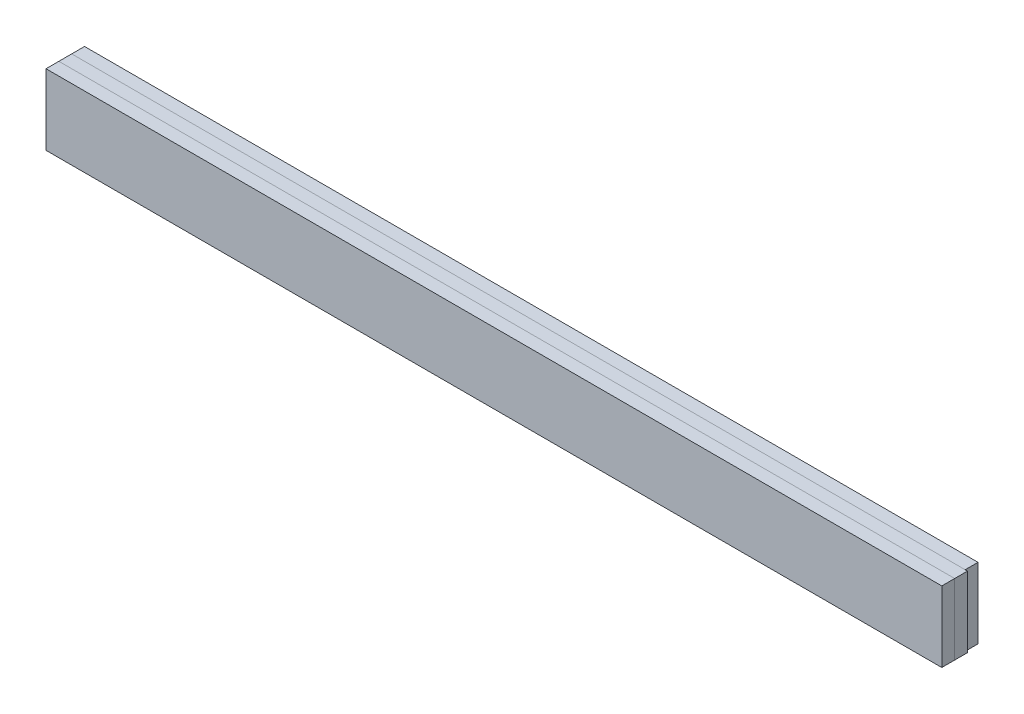
ISO-10303-21;
HEADER;
FILE_DESCRIPTION(('STEP AP214'),'2;1');
FILE_NAME('part.step','',(''),(''),'','','');
FILE_SCHEMA(('AUTOMOTIVE_DESIGN { 1 0 10303 214 1 1 1 1 }'));
ENDSEC;
DATA;
#1=APPLICATION_CONTEXT('core data for automotive mechanical design processes');
#2=APPLICATION_PROTOCOL_DEFINITION('international standard','automotive_design',2000,#1);
#3=PRODUCT_CONTEXT('',#1,'mechanical');
#4=PRODUCT('Part','Part','',(#3));
#5=PRODUCT_RELATED_PRODUCT_CATEGORY('part','',(#4));
#6=PRODUCT_DEFINITION_FORMATION('','',#4);
#7=PRODUCT_DEFINITION_CONTEXT('part definition',#1,'design');
#8=PRODUCT_DEFINITION('design','',#6,#7);
#9=PRODUCT_DEFINITION_SHAPE('','',#8);
#10=(LENGTH_UNIT() NAMED_UNIT(*) SI_UNIT(.MILLI.,.METRE.));
#11=(NAMED_UNIT(*) PLANE_ANGLE_UNIT() SI_UNIT($,.RADIAN.));
#12=(NAMED_UNIT(*) SI_UNIT($,.STERADIAN.) SOLID_ANGLE_UNIT());
#13=UNCERTAINTY_MEASURE_WITH_UNIT(LENGTH_MEASURE(1.E-05),#10,'distance_accuracy_value','');
#14=(GEOMETRIC_REPRESENTATION_CONTEXT(3) GLOBAL_UNCERTAINTY_ASSIGNED_CONTEXT((#13)) GLOBAL_UNIT_ASSIGNED_CONTEXT((#10,
#11,#12)) REPRESENTATION_CONTEXT('',''));
#15=CARTESIAN_POINT('',(0.,0.,0.));
#16=DIRECTION('',(0.,0.,1.));
#17=DIRECTION('',(1.,0.,0.));
#18=AXIS2_PLACEMENT_3D('',#15,#16,#17);
#19=CARTESIAN_POINT('',(34.667480873793,5.5,-1.5));
#20=DIRECTION('',(-1.,0.,0.));
#21=DIRECTION('',(0.,0.,1.));
#22=AXIS2_PLACEMENT_3D('',#19,#20,#21);
#23=PLANE('',#22);
#24=DIRECTION('',(0.,-1.,0.));
#25=VECTOR('',#24,1.);
#26=CARTESIAN_POINT('',(34.667480873793,5.5,-0.5));
#27=LINE('',#26,#25);
#28=CARTESIAN_POINT('',(34.667480873793,5.5,-0.5));
#29=VERTEX_POINT('',#28);
#30=CARTESIAN_POINT('',(34.667480873793,0.,-0.5));
#31=VERTEX_POINT('',#30);
#32=EDGE_CURVE('E110',#29,#31,#27,.T.);
#33=ORIENTED_EDGE('',*,*,#32,.T.);
#34=DIRECTION('',(0.,0.,1.));
#35=VECTOR('',#34,1.);
#36=CARTESIAN_POINT('',(34.667480873793,0.,-1.5));
#37=LINE('',#36,#35);
#38=CARTESIAN_POINT('',(34.667480873793,0.,-1.5));
#39=VERTEX_POINT('',#38);
#40=EDGE_CURVE('E12',#39,#31,#37,.T.);
#41=ORIENTED_EDGE('',*,*,#40,.F.);
#42=DIRECTION('',(0.,-1.,0.));
#43=VECTOR('',#42,1.);
#44=CARTESIAN_POINT('',(34.667480873793,5.5,-1.5));
#45=LINE('',#44,#43);
#46=CARTESIAN_POINT('',(34.667480873793,5.5,-1.5));
#47=VERTEX_POINT('',#46);
#48=EDGE_CURVE('E98',#47,#39,#45,.T.);
#49=ORIENTED_EDGE('',*,*,#48,.F.);
#50=DIRECTION('',(0.,0.,1.));
#51=VECTOR('',#50,1.);
#52=CARTESIAN_POINT('',(34.667480873793,5.5,-1.5));
#53=LINE('',#52,#51);
#54=EDGE_CURVE('E106',#47,#29,#53,.T.);
#55=ORIENTED_EDGE('',*,*,#54,.T.);
#56=EDGE_LOOP('',(#33,#41,#49,#55));
#57=FACE_BOUND('',#56,.T.);
#58=ADVANCED_FACE('F47',(#57),#23,.F.);
#59=CARTESIAN_POINT('',(34.667480873793,0.,-1.5));
#60=DIRECTION('',(0.,1.,0.));
#61=DIRECTION('',(0.,0.,1.));
#62=AXIS2_PLACEMENT_3D('',#59,#60,#61);
#63=PLANE('',#62);
#64=DIRECTION('',(-1.,0.,0.));
#65=VECTOR('',#64,1.);
#66=CARTESIAN_POINT('',(34.667480873793,0.,-0.5));
#67=LINE('',#66,#65);
#68=CARTESIAN_POINT('',(-34.85,0.,-0.5));
#69=VERTEX_POINT('',#68);
#70=EDGE_CURVE('E102',#31,#69,#67,.T.);
#71=ORIENTED_EDGE('',*,*,#70,.T.);
#72=DIRECTION('',(0.,0.,1.));
#73=VECTOR('',#72,1.);
#74=CARTESIAN_POINT('',(-34.85,0.,-1.5));
#75=LINE('',#74,#73);
#76=CARTESIAN_POINT('',(-34.85,0.,-1.5));
#77=VERTEX_POINT('',#76);
#78=EDGE_CURVE('E55',#77,#69,#75,.T.);
#79=ORIENTED_EDGE('',*,*,#78,.F.);
#80=DIRECTION('',(-1.,0.,0.));
#81=VECTOR('',#80,1.);
#82=CARTESIAN_POINT('',(34.667480873793,0.,-1.5));
#83=LINE('',#82,#81);
#84=EDGE_CURVE('E93',#39,#77,#83,.T.);
#85=ORIENTED_EDGE('',*,*,#84,.F.);
#86=ORIENTED_EDGE('',*,*,#40,.T.);
#87=EDGE_LOOP('',(#71,#79,#85,#86));
#88=FACE_BOUND('',#87,.T.);
#89=ADVANCED_FACE('F101',(#88),#63,.F.);
#90=CARTESIAN_POINT('',(-34.85,5.5,-1.5));
#91=DIRECTION('',(1.,0.,0.));
#92=DIRECTION('',(0.,0.,-1.));
#93=AXIS2_PLACEMENT_3D('',#90,#91,#92);
#94=PLANE('',#93);
#95=DIRECTION('',(0.,1.,0.));
#96=VECTOR('',#95,1.);
#97=CARTESIAN_POINT('',(-34.85,5.5,-0.5));
#98=LINE('',#97,#96);
#99=CARTESIAN_POINT('',(-34.85,5.5,-0.5));
#100=VERTEX_POINT('',#99);
#101=EDGE_CURVE('E80',#69,#100,#98,.T.);
#102=ORIENTED_EDGE('',*,*,#101,.T.);
#103=DIRECTION('',(0.,0.,1.));
#104=VECTOR('',#103,1.);
#105=CARTESIAN_POINT('',(-34.85,5.5,-1.5));
#106=LINE('',#105,#104);
#107=CARTESIAN_POINT('',(-34.85,5.5,-1.5));
#108=VERTEX_POINT('',#107);
#109=EDGE_CURVE('E103',#108,#100,#106,.T.);
#110=ORIENTED_EDGE('',*,*,#109,.F.);
#111=DIRECTION('',(0.,1.,0.));
#112=VECTOR('',#111,1.);
#113=CARTESIAN_POINT('',(-34.85,5.5,-1.5));
#114=LINE('',#113,#112);
#115=EDGE_CURVE('E96',#77,#108,#114,.T.);
#116=ORIENTED_EDGE('',*,*,#115,.F.);
#117=ORIENTED_EDGE('',*,*,#78,.T.);
#118=EDGE_LOOP('',(#102,#110,#116,#117));
#119=FACE_BOUND('',#118,.T.);
#120=ADVANCED_FACE('F104',(#119),#94,.F.);
#121=CARTESIAN_POINT('',(34.667480873793,5.5,-1.5));
#122=DIRECTION('',(0.,-1.,0.));
#123=DIRECTION('',(0.,0.,-1.));
#124=AXIS2_PLACEMENT_3D('',#121,#122,#123);
#125=PLANE('',#124);
#126=DIRECTION('',(1.,0.,0.));
#127=VECTOR('',#126,1.);
#128=CARTESIAN_POINT('',(34.667480873793,5.5,-0.5));
#129=LINE('',#128,#127);
#130=EDGE_CURVE('E86',#100,#29,#129,.T.);
#131=ORIENTED_EDGE('',*,*,#130,.T.);
#132=ORIENTED_EDGE('',*,*,#54,.F.);
#133=DIRECTION('',(1.,0.,0.));
#134=VECTOR('',#133,1.);
#135=CARTESIAN_POINT('',(34.667480873793,5.5,-1.5));
#136=LINE('',#135,#134);
#137=EDGE_CURVE('E63',#108,#47,#136,.T.);
#138=ORIENTED_EDGE('',*,*,#137,.F.);
#139=ORIENTED_EDGE('',*,*,#109,.T.);
#140=EDGE_LOOP('',(#131,#132,#138,#139));
#141=FACE_BOUND('',#140,.T.);
#142=ADVANCED_FACE('F117',(#141),#125,.F.);
#143=CARTESIAN_POINT('',(0.,0.,-1.5));
#144=DIRECTION('',(0.,0.,-1.));
#145=DIRECTION('',(-1.,0.,0.));
#146=AXIS2_PLACEMENT_3D('',#143,#144,#145);
#147=PLANE('',#146);
#148=ORIENTED_EDGE('',*,*,#48,.T.);
#149=ORIENTED_EDGE('',*,*,#84,.T.);
#150=ORIENTED_EDGE('',*,*,#115,.T.);
#151=ORIENTED_EDGE('',*,*,#137,.T.);
#152=EDGE_LOOP('',(#148,#149,#150,#151));
#153=FACE_BOUND('',#152,.T.);
#154=ADVANCED_FACE('F94',(#153),#147,.T.);
#155=CARTESIAN_POINT('',(0.,0.,-0.5));
#156=DIRECTION('',(0.,0.,-1.));
#157=DIRECTION('',(-1.,0.,0.));
#158=AXIS2_PLACEMENT_3D('',#155,#156,#157);
#159=PLANE('',#158);
#160=ORIENTED_EDGE('',*,*,#32,.F.);
#161=ORIENTED_EDGE('',*,*,#130,.F.);
#162=ORIENTED_EDGE('',*,*,#101,.F.);
#163=ORIENTED_EDGE('',*,*,#70,.F.);
#164=EDGE_LOOP('',(#160,#161,#162,#163));
#165=FACE_BOUND('',#164,.T.);
#166=ADVANCED_FACE('F120',(#165),#159,.F.);
#167=CLOSED_SHELL('',(#58,#89,#120,#142,#154,#166));
#168=MANIFOLD_SOLID_BREP('B2',#167);
#169=CARTESIAN_POINT('',(-34.85,5.5,1.5));
#170=DIRECTION('',(1.,0.,0.));
#171=DIRECTION('',(0.,0.,-1.));
#172=AXIS2_PLACEMENT_3D('',#169,#170,#171);
#173=PLANE('',#172);
#174=DIRECTION('',(0.,-1.,0.));
#175=VECTOR('',#174,1.);
#176=CARTESIAN_POINT('',(-34.85,5.5,0.5));
#177=LINE('',#176,#175);
#178=CARTESIAN_POINT('',(-34.85,5.5,0.5));
#179=VERTEX_POINT('',#178);
#180=CARTESIAN_POINT('',(-34.85,0.,0.5));
#181=VERTEX_POINT('',#180);
#182=EDGE_CURVE('E242',#179,#181,#177,.T.);
#183=ORIENTED_EDGE('',*,*,#182,.T.);
#184=DIRECTION('',(0.,0.,-1.));
#185=VECTOR('',#184,1.);
#186=CARTESIAN_POINT('',(-34.85,0.,1.5));
#187=LINE('',#186,#185);
#188=CARTESIAN_POINT('',(-34.85,0.,1.5));
#189=VERTEX_POINT('',#188);
#190=EDGE_CURVE('E45',#189,#181,#187,.T.);
#191=ORIENTED_EDGE('',*,*,#190,.F.);
#192=DIRECTION('',(0.,-1.,0.));
#193=VECTOR('',#192,1.);
#194=CARTESIAN_POINT('',(-34.85,5.5,1.5));
#195=LINE('',#194,#193);
#196=CARTESIAN_POINT('',(-34.85,5.5,1.5));
#197=VERTEX_POINT('',#196);
#198=EDGE_CURVE('E230',#197,#189,#195,.T.);
#199=ORIENTED_EDGE('',*,*,#198,.F.);
#200=DIRECTION('',(0.,0.,-1.));
#201=VECTOR('',#200,1.);
#202=CARTESIAN_POINT('',(-34.85,5.5,1.5));
#203=LINE('',#202,#201);
#204=EDGE_CURVE('E238',#197,#179,#203,.T.);
#205=ORIENTED_EDGE('',*,*,#204,.T.);
#206=EDGE_LOOP('',(#183,#191,#199,#205));
#207=FACE_BOUND('',#206,.T.);
#208=ADVANCED_FACE('F179',(#207),#173,.F.);
#209=CARTESIAN_POINT('',(-34.85,0.,1.5));
#210=DIRECTION('',(0.,1.,0.));
#211=DIRECTION('',(0.,0.,1.));
#212=AXIS2_PLACEMENT_3D('',#209,#210,#211);
#213=PLANE('',#212);
#214=DIRECTION('',(1.,0.,0.));
#215=VECTOR('',#214,1.);
#216=CARTESIAN_POINT('',(-34.85,0.,0.5));
#217=LINE('',#216,#215);
#218=CARTESIAN_POINT('',(34.85,0.,0.5));
#219=VERTEX_POINT('',#218);
#220=EDGE_CURVE('E234',#181,#219,#217,.T.);
#221=ORIENTED_EDGE('',*,*,#220,.T.);
#222=DIRECTION('',(0.,0.,-1.));
#223=VECTOR('',#222,1.);
#224=CARTESIAN_POINT('',(34.85,0.,1.5));
#225=LINE('',#224,#223);
#226=CARTESIAN_POINT('',(34.85,0.,1.5));
#227=VERTEX_POINT('',#226);
#228=EDGE_CURVE('E187',#227,#219,#225,.T.);
#229=ORIENTED_EDGE('',*,*,#228,.F.);
#230=DIRECTION('',(1.,0.,0.));
#231=VECTOR('',#230,1.);
#232=CARTESIAN_POINT('',(-34.85,0.,1.5));
#233=LINE('',#232,#231);
#234=EDGE_CURVE('E225',#189,#227,#233,.T.);
#235=ORIENTED_EDGE('',*,*,#234,.F.);
#236=ORIENTED_EDGE('',*,*,#190,.T.);
#237=EDGE_LOOP('',(#221,#229,#235,#236));
#238=FACE_BOUND('',#237,.T.);
#239=ADVANCED_FACE('F233',(#238),#213,.F.);
#240=CARTESIAN_POINT('',(34.85,5.5,1.5));
#241=DIRECTION('',(-1.,0.,0.));
#242=DIRECTION('',(0.,0.,1.));
#243=AXIS2_PLACEMENT_3D('',#240,#241,#242);
#244=PLANE('',#243);
#245=DIRECTION('',(0.,1.,0.));
#246=VECTOR('',#245,1.);
#247=CARTESIAN_POINT('',(34.85,5.5,0.5));
#248=LINE('',#247,#246);
#249=CARTESIAN_POINT('',(34.85,5.5,0.5));
#250=VERTEX_POINT('',#249);
#251=EDGE_CURVE('E212',#219,#250,#248,.T.);
#252=ORIENTED_EDGE('',*,*,#251,.T.);
#253=DIRECTION('',(0.,0.,-1.));
#254=VECTOR('',#253,1.);
#255=CARTESIAN_POINT('',(34.85,5.5,1.5));
#256=LINE('',#255,#254);
#257=CARTESIAN_POINT('',(34.85,5.5,1.5));
#258=VERTEX_POINT('',#257);
#259=EDGE_CURVE('E235',#258,#250,#256,.T.);
#260=ORIENTED_EDGE('',*,*,#259,.F.);
#261=DIRECTION('',(0.,1.,0.));
#262=VECTOR('',#261,1.);
#263=CARTESIAN_POINT('',(34.85,5.5,1.5));
#264=LINE('',#263,#262);
#265=EDGE_CURVE('E228',#227,#258,#264,.T.);
#266=ORIENTED_EDGE('',*,*,#265,.F.);
#267=ORIENTED_EDGE('',*,*,#228,.T.);
#268=EDGE_LOOP('',(#252,#260,#266,#267));
#269=FACE_BOUND('',#268,.T.);
#270=ADVANCED_FACE('F236',(#269),#244,.F.);
#271=CARTESIAN_POINT('',(-34.85,5.5,1.5));
#272=DIRECTION('',(0.,-1.,0.));
#273=DIRECTION('',(0.,0.,-1.));
#274=AXIS2_PLACEMENT_3D('',#271,#272,#273);
#275=PLANE('',#274);
#276=DIRECTION('',(-1.,0.,0.));
#277=VECTOR('',#276,1.);
#278=CARTESIAN_POINT('',(-34.85,5.5,0.5));
#279=LINE('',#278,#277);
#280=EDGE_CURVE('E218',#250,#179,#279,.T.);
#281=ORIENTED_EDGE('',*,*,#280,.T.);
#282=ORIENTED_EDGE('',*,*,#204,.F.);
#283=DIRECTION('',(-1.,0.,0.));
#284=VECTOR('',#283,1.);
#285=CARTESIAN_POINT('',(-34.85,5.5,1.5));
#286=LINE('',#285,#284);
#287=EDGE_CURVE('E195',#258,#197,#286,.T.);
#288=ORIENTED_EDGE('',*,*,#287,.F.);
#289=ORIENTED_EDGE('',*,*,#259,.T.);
#290=EDGE_LOOP('',(#281,#282,#288,#289));
#291=FACE_BOUND('',#290,.T.);
#292=ADVANCED_FACE('F249',(#291),#275,.F.);
#293=CARTESIAN_POINT('',(0.,0.,1.5));
#294=DIRECTION('',(0.,0.,1.));
#295=DIRECTION('',(1.,0.,0.));
#296=AXIS2_PLACEMENT_3D('',#293,#294,#295);
#297=PLANE('',#296);
#298=ORIENTED_EDGE('',*,*,#198,.T.);
#299=ORIENTED_EDGE('',*,*,#234,.T.);
#300=ORIENTED_EDGE('',*,*,#265,.T.);
#301=ORIENTED_EDGE('',*,*,#287,.T.);
#302=EDGE_LOOP('',(#298,#299,#300,#301));
#303=FACE_BOUND('',#302,.T.);
#304=ADVANCED_FACE('F226',(#303),#297,.T.);
#305=CARTESIAN_POINT('',(0.,0.,0.5));
#306=DIRECTION('',(0.,0.,1.));
#307=DIRECTION('',(1.,0.,0.));
#308=AXIS2_PLACEMENT_3D('',#305,#306,#307);
#309=PLANE('',#308);
#310=ORIENTED_EDGE('',*,*,#182,.F.);
#311=ORIENTED_EDGE('',*,*,#280,.F.);
#312=ORIENTED_EDGE('',*,*,#251,.F.);
#313=ORIENTED_EDGE('',*,*,#220,.F.);
#314=EDGE_LOOP('',(#310,#311,#312,#313));
#315=FACE_BOUND('',#314,.T.);
#316=ADVANCED_FACE('F252',(#315),#309,.F.);
#317=CLOSED_SHELL('',(#208,#239,#270,#292,#304,#316));
#318=MANIFOLD_SOLID_BREP('B6',#317);
#319=CARTESIAN_POINT('',(-34.85,5.5,0.5));
#320=DIRECTION('',(1.,0.,0.));
#321=DIRECTION('',(0.,0.,-1.));
#322=AXIS2_PLACEMENT_3D('',#319,#320,#321);
#323=PLANE('',#322);
#324=DIRECTION('',(0.,-1.,0.));
#325=VECTOR('',#324,1.);
#326=CARTESIAN_POINT('',(-34.85,5.5,-0.5));
#327=LINE('',#326,#325);
#328=CARTESIAN_POINT('',(-34.85,5.5,-0.5));
#329=VERTEX_POINT('',#328);
#330=CARTESIAN_POINT('',(-34.85,0.,-0.5));
#331=VERTEX_POINT('',#330);
#332=EDGE_CURVE('E365',#329,#331,#327,.T.);
#333=ORIENTED_EDGE('',*,*,#332,.T.);
#334=DIRECTION('',(0.,0.,-1.));
#335=VECTOR('',#334,1.);
#336=CARTESIAN_POINT('',(-34.85,0.,0.5));
#337=LINE('',#336,#335);
#338=CARTESIAN_POINT('',(-34.85,0.,0.5));
#339=VERTEX_POINT('',#338);
#340=EDGE_CURVE('E177',#339,#331,#337,.T.);
#341=ORIENTED_EDGE('',*,*,#340,.F.);
#342=DIRECTION('',(0.,-1.,0.));
#343=VECTOR('',#342,1.);
#344=CARTESIAN_POINT('',(-34.85,5.5,0.5));
#345=LINE('',#344,#343);
#346=CARTESIAN_POINT('',(-34.85,5.5,0.5));
#347=VERTEX_POINT('',#346);
#348=EDGE_CURVE('E353',#347,#339,#345,.T.);
#349=ORIENTED_EDGE('',*,*,#348,.F.);
#350=DIRECTION('',(0.,0.,-1.));
#351=VECTOR('',#350,1.);
#352=CARTESIAN_POINT('',(-34.85,5.5,0.5));
#353=LINE('',#352,#351);
#354=EDGE_CURVE('E361',#347,#329,#353,.T.);
#355=ORIENTED_EDGE('',*,*,#354,.T.);
#356=EDGE_LOOP('',(#333,#341,#349,#355));
#357=FACE_BOUND('',#356,.T.);
#358=ADVANCED_FACE('F302',(#357),#323,.F.);
#359=CARTESIAN_POINT('',(-34.85,0.,0.5));
#360=DIRECTION('',(0.,1.,0.));
#361=DIRECTION('',(0.,0.,1.));
#362=AXIS2_PLACEMENT_3D('',#359,#360,#361);
#363=PLANE('',#362);
#364=DIRECTION('',(1.,0.,0.));
#365=VECTOR('',#364,1.);
#366=CARTESIAN_POINT('',(-34.85,0.,-0.5));
#367=LINE('',#366,#365);
#368=CARTESIAN_POINT('',(34.85,0.,-0.5));
#369=VERTEX_POINT('',#368);
#370=EDGE_CURVE('E357',#331,#369,#367,.T.);
#371=ORIENTED_EDGE('',*,*,#370,.T.);
#372=DIRECTION('',(0.,0.,-1.));
#373=VECTOR('',#372,1.);
#374=CARTESIAN_POINT('',(34.85,0.,0.5));
#375=LINE('',#374,#373);
#376=CARTESIAN_POINT('',(34.85,0.,0.5));
#377=VERTEX_POINT('',#376);
#378=EDGE_CURVE('E310',#377,#369,#375,.T.);
#379=ORIENTED_EDGE('',*,*,#378,.F.);
#380=DIRECTION('',(1.,0.,0.));
#381=VECTOR('',#380,1.);
#382=CARTESIAN_POINT('',(-34.85,0.,0.5));
#383=LINE('',#382,#381);
#384=EDGE_CURVE('E348',#339,#377,#383,.T.);
#385=ORIENTED_EDGE('',*,*,#384,.F.);
#386=ORIENTED_EDGE('',*,*,#340,.T.);
#387=EDGE_LOOP('',(#371,#379,#385,#386));
#388=FACE_BOUND('',#387,.T.);
#389=ADVANCED_FACE('F356',(#388),#363,.F.);
#390=CARTESIAN_POINT('',(34.85,5.5,0.5));
#391=DIRECTION('',(-1.,0.,0.));
#392=DIRECTION('',(0.,0.,1.));
#393=AXIS2_PLACEMENT_3D('',#390,#391,#392);
#394=PLANE('',#393);
#395=DIRECTION('',(0.,1.,0.));
#396=VECTOR('',#395,1.);
#397=CARTESIAN_POINT('',(34.85,5.5,-0.5));
#398=LINE('',#397,#396);
#399=CARTESIAN_POINT('',(34.85,5.5,-0.5));
#400=VERTEX_POINT('',#399);
#401=EDGE_CURVE('E335',#369,#400,#398,.T.);
#402=ORIENTED_EDGE('',*,*,#401,.T.);
#403=DIRECTION('',(0.,0.,-1.));
#404=VECTOR('',#403,1.);
#405=CARTESIAN_POINT('',(34.85,5.5,0.5));
#406=LINE('',#405,#404);
#407=CARTESIAN_POINT('',(34.85,5.5,0.5));
#408=VERTEX_POINT('',#407);
#409=EDGE_CURVE('E358',#408,#400,#406,.T.);
#410=ORIENTED_EDGE('',*,*,#409,.F.);
#411=DIRECTION('',(0.,1.,0.));
#412=VECTOR('',#411,1.);
#413=CARTESIAN_POINT('',(34.85,5.5,0.5));
#414=LINE('',#413,#412);
#415=EDGE_CURVE('E351',#377,#408,#414,.T.);
#416=ORIENTED_EDGE('',*,*,#415,.F.);
#417=ORIENTED_EDGE('',*,*,#378,.T.);
#418=EDGE_LOOP('',(#402,#410,#416,#417));
#419=FACE_BOUND('',#418,.T.);
#420=ADVANCED_FACE('F359',(#419),#394,.F.);
#421=CARTESIAN_POINT('',(-34.85,5.5,0.5));
#422=DIRECTION('',(0.,-1.,0.));
#423=DIRECTION('',(0.,0.,-1.));
#424=AXIS2_PLACEMENT_3D('',#421,#422,#423);
#425=PLANE('',#424);
#426=DIRECTION('',(-1.,0.,0.));
#427=VECTOR('',#426,1.);
#428=CARTESIAN_POINT('',(-34.85,5.5,-0.5));
#429=LINE('',#428,#427);
#430=EDGE_CURVE('E341',#400,#329,#429,.T.);
#431=ORIENTED_EDGE('',*,*,#430,.T.);
#432=ORIENTED_EDGE('',*,*,#354,.F.);
#433=DIRECTION('',(-1.,0.,0.));
#434=VECTOR('',#433,1.);
#435=CARTESIAN_POINT('',(-34.85,5.5,0.5));
#436=LINE('',#435,#434);
#437=EDGE_CURVE('E318',#408,#347,#436,.T.);
#438=ORIENTED_EDGE('',*,*,#437,.F.);
#439=ORIENTED_EDGE('',*,*,#409,.T.);
#440=EDGE_LOOP('',(#431,#432,#438,#439));
#441=FACE_BOUND('',#440,.T.);
#442=ADVANCED_FACE('F372',(#441),#425,.F.);
#443=CARTESIAN_POINT('',(0.,0.,0.5));
#444=DIRECTION('',(0.,0.,1.));
#445=DIRECTION('',(1.,0.,0.));
#446=AXIS2_PLACEMENT_3D('',#443,#444,#445);
#447=PLANE('',#446);
#448=ORIENTED_EDGE('',*,*,#348,.T.);
#449=ORIENTED_EDGE('',*,*,#384,.T.);
#450=ORIENTED_EDGE('',*,*,#415,.T.);
#451=ORIENTED_EDGE('',*,*,#437,.T.);
#452=EDGE_LOOP('',(#448,#449,#450,#451));
#453=FACE_BOUND('',#452,.T.);
#454=ADVANCED_FACE('F349',(#453),#447,.T.);
#455=CARTESIAN_POINT('',(0.,0.,-0.5));
#456=DIRECTION('',(0.,0.,1.));
#457=DIRECTION('',(1.,0.,0.));
#458=AXIS2_PLACEMENT_3D('',#455,#456,#457);
#459=PLANE('',#458);
#460=ORIENTED_EDGE('',*,*,#332,.F.);
#461=ORIENTED_EDGE('',*,*,#430,.F.);
#462=ORIENTED_EDGE('',*,*,#401,.F.);
#463=ORIENTED_EDGE('',*,*,#370,.F.);
#464=EDGE_LOOP('',(#460,#461,#462,#463));
#465=FACE_BOUND('',#464,.T.);
#466=ADVANCED_FACE('F375',(#465),#459,.F.);
#467=CLOSED_SHELL('',(#358,#389,#420,#442,#454,#466));
#468=MANIFOLD_SOLID_BREP('B39',#467);
#469=ADVANCED_BREP_SHAPE_REPRESENTATION('',(#18,#168,#318,#468),#14);
#470=SHAPE_DEFINITION_REPRESENTATION(#9,#469);
ENDSEC;
END-ISO-10303-21;
